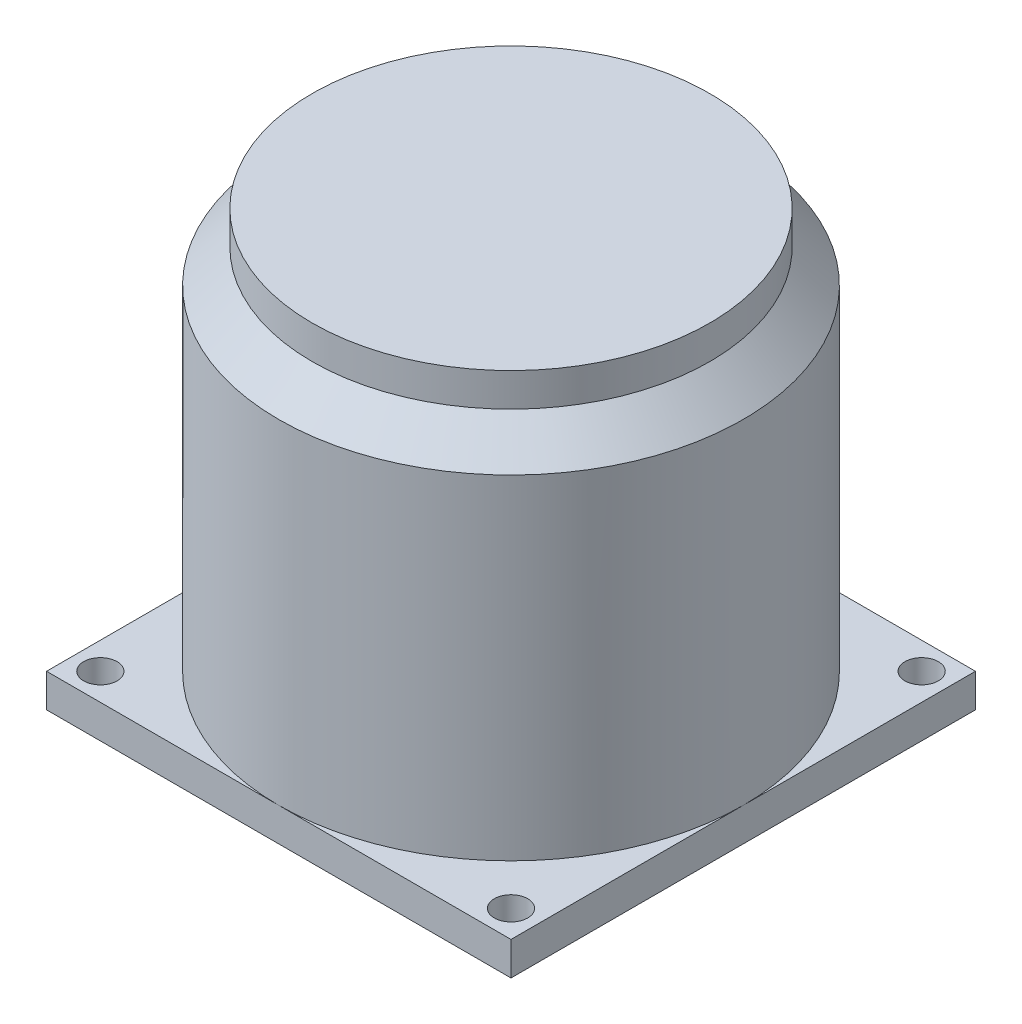
ISO-10303-21;
HEADER;
FILE_DESCRIPTION(('STEP AP214'),'2;1');
FILE_NAME('part.step','',(''),(''),'','','');
FILE_SCHEMA(('AUTOMOTIVE_DESIGN { 1 0 10303 214 1 1 1 1 }'));
ENDSEC;
DATA;
#1=APPLICATION_CONTEXT('core data for automotive mechanical design processes');
#2=APPLICATION_PROTOCOL_DEFINITION('international standard','automotive_design',2000,#1);
#3=PRODUCT_CONTEXT('',#1,'mechanical');
#4=PRODUCT('Part','Part','',(#3));
#5=PRODUCT_RELATED_PRODUCT_CATEGORY('part','',(#4));
#6=PRODUCT_DEFINITION_FORMATION('','',#4);
#7=PRODUCT_DEFINITION_CONTEXT('part definition',#1,'design');
#8=PRODUCT_DEFINITION('design','',#6,#7);
#9=PRODUCT_DEFINITION_SHAPE('','',#8);
#10=(LENGTH_UNIT() NAMED_UNIT(*) SI_UNIT(.MILLI.,.METRE.));
#11=(NAMED_UNIT(*) PLANE_ANGLE_UNIT() SI_UNIT($,.RADIAN.));
#12=(NAMED_UNIT(*) SI_UNIT($,.STERADIAN.) SOLID_ANGLE_UNIT());
#13=UNCERTAINTY_MEASURE_WITH_UNIT(LENGTH_MEASURE(1.E-05),#10,'distance_accuracy_value','');
#14=(GEOMETRIC_REPRESENTATION_CONTEXT(3) GLOBAL_UNCERTAINTY_ASSIGNED_CONTEXT((#13)) GLOBAL_UNIT_ASSIGNED_CONTEXT((#10,
#11,#12)) REPRESENTATION_CONTEXT('',''));
#15=CARTESIAN_POINT('',(0.,0.,0.));
#16=DIRECTION('',(0.,0.,1.));
#17=DIRECTION('',(1.,0.,0.));
#18=AXIS2_PLACEMENT_3D('',#15,#16,#17);
#19=CARTESIAN_POINT('',(0.,220.,0.));
#20=DIRECTION('',(0.,-1.,0.));
#21=DIRECTION('',(0.,0.,-1.));
#22=AXIS2_PLACEMENT_3D('',#19,#20,#21);
#23=CYLINDRICAL_SURFACE('',#22,139.);
#24=CARTESIAN_POINT('',(0.,200.,0.));
#25=DIRECTION('',(0.,1.,0.));
#26=DIRECTION('',(0.,0.,1.));
#27=AXIS2_PLACEMENT_3D('',#24,#25,#26);
#28=CIRCLE('',#27,139.);
#29=CARTESIAN_POINT('',(0.,200.,139.));
#30=VERTEX_POINT('',#29);
#31=EDGE_CURVE('E11',#30,#30,#28,.F.);
#32=ORIENTED_EDGE('',*,*,#31,.T.);
#33=EDGE_LOOP('',(#32));
#34=FACE_BOUND('',#33,.T.);
#35=CARTESIAN_POINT('',(0.,0.,0.));
#36=DIRECTION('',(0.,1.,0.));
#37=DIRECTION('',(0.,0.,1.));
#38=AXIS2_PLACEMENT_3D('',#35,#36,#37);
#39=CIRCLE('',#38,139.);
#40=CARTESIAN_POINT('',(0.,0.,139.));
#41=VERTEX_POINT('',#40);
#42=CARTESIAN_POINT('',(139.,0.,0.));
#43=VERTEX_POINT('',#42);
#44=EDGE_CURVE('E163',#41,#43,#39,.T.);
#45=ORIENTED_EDGE('',*,*,#44,.T.);
#46=CARTESIAN_POINT('',(0.,0.,-139.));
#47=VERTEX_POINT('',#46);
#48=EDGE_CURVE('E165',#43,#47,#39,.T.);
#49=ORIENTED_EDGE('',*,*,#48,.T.);
#50=CARTESIAN_POINT('',(-139.,0.,0.));
#51=VERTEX_POINT('',#50);
#52=EDGE_CURVE('E57',#47,#51,#39,.T.);
#53=ORIENTED_EDGE('',*,*,#52,.T.);
#54=EDGE_CURVE('E162',#51,#41,#39,.T.);
#55=ORIENTED_EDGE('',*,*,#54,.T.);
#56=EDGE_LOOP('',(#45,#49,#53,#55));
#57=FACE_BOUND('',#56,.T.);
#58=ADVANCED_FACE('F34',(#34,#57),#23,.T.);
#59=CARTESIAN_POINT('',(0.,220.,0.));
#60=DIRECTION('',(0.,-1.,0.));
#61=DIRECTION('',(0.,0.,-1.));
#62=AXIS2_PLACEMENT_3D('',#59,#60,#61);
#63=CONICAL_SURFACE('',#62,119.,0.785398163397449);
#64=ORIENTED_EDGE('',*,*,#31,.F.);
#65=EDGE_LOOP('',(#64));
#66=FACE_BOUND('',#65,.T.);
#67=CARTESIAN_POINT('',(0.,220.,0.));
#68=DIRECTION('',(0.,1.,0.));
#69=DIRECTION('',(0.,0.,1.));
#70=AXIS2_PLACEMENT_3D('',#67,#68,#69);
#71=CIRCLE('',#70,119.);
#72=CARTESIAN_POINT('',(0.,220.,119.));
#73=VERTEX_POINT('',#72);
#74=EDGE_CURVE('E42',#73,#73,#71,.T.);
#75=ORIENTED_EDGE('',*,*,#74,.F.);
#76=EDGE_LOOP('',(#75));
#77=FACE_BOUND('',#76,.T.);
#78=ADVANCED_FACE('F36',(#66,#77),#63,.T.);
#79=CARTESIAN_POINT('',(0.,240.,0.));
#80=DIRECTION('',(0.,-1.,0.));
#81=DIRECTION('',(0.,0.,-1.));
#82=AXIS2_PLACEMENT_3D('',#79,#80,#81);
#83=CYLINDRICAL_SURFACE('',#82,119.);
#84=CARTESIAN_POINT('',(0.,240.,0.));
#85=DIRECTION('',(0.,1.,0.));
#86=DIRECTION('',(0.,0.,1.));
#87=AXIS2_PLACEMENT_3D('',#84,#85,#86);
#88=CIRCLE('',#87,119.);
#89=CARTESIAN_POINT('',(0.,240.,119.));
#90=VERTEX_POINT('',#89);
#91=EDGE_CURVE('E100',#90,#90,#88,.T.);
#92=ORIENTED_EDGE('',*,*,#91,.F.);
#93=EDGE_LOOP('',(#92));
#94=FACE_BOUND('',#93,.T.);
#95=ORIENTED_EDGE('',*,*,#74,.T.);
#96=EDGE_LOOP('',(#95));
#97=FACE_BOUND('',#96,.T.);
#98=ADVANCED_FACE('F169',(#94,#97),#83,.T.);
#99=CARTESIAN_POINT('',(0.,240.,0.));
#100=DIRECTION('',(0.,1.,0.));
#101=DIRECTION('',(0.,0.,1.));
#102=AXIS2_PLACEMENT_3D('',#99,#100,#101);
#103=PLANE('',#102);
#104=ORIENTED_EDGE('',*,*,#91,.T.);
#105=EDGE_LOOP('',(#104));
#106=FACE_BOUND('',#105,.T.);
#107=ADVANCED_FACE('F177',(#106),#103,.T.);
#108=CARTESIAN_POINT('',(0.,0.,0.));
#109=DIRECTION('',(0.,-1.,0.));
#110=DIRECTION('',(0.,0.,-1.));
#111=AXIS2_PLACEMENT_3D('',#108,#109,#110);
#112=PLANE('',#111);
#113=ORIENTED_EDGE('',*,*,#44,.F.);
#114=DIRECTION('',(1.,0.,0.));
#115=VECTOR('',#114,1.);
#116=CARTESIAN_POINT('',(0.,0.,139.));
#117=LINE('',#116,#115);
#118=CARTESIAN_POINT('',(139.,0.,139.));
#119=VERTEX_POINT('',#118);
#120=EDGE_CURVE('E145',#41,#119,#117,.T.);
#121=ORIENTED_EDGE('',*,*,#120,.T.);
#122=DIRECTION('',(0.,0.,1.));
#123=VECTOR('',#122,1.);
#124=CARTESIAN_POINT('',(139.,0.,0.));
#125=LINE('',#124,#123);
#126=EDGE_CURVE('E141',#43,#119,#125,.T.);
#127=ORIENTED_EDGE('',*,*,#126,.F.);
#128=EDGE_LOOP('',(#113,#121,#127));
#129=FACE_BOUND('',#128,.T.);
#130=CARTESIAN_POINT('',(122.899316497498,0.,122.899316497498));
#131=DIRECTION('',(0.,-1.,0.));
#132=DIRECTION('',(0.,0.,-1.));
#133=AXIS2_PLACEMENT_3D('',#130,#131,#132);
#134=CIRCLE('',#133,10.);
#135=CARTESIAN_POINT('',(122.899316497498,0.,112.899316497498));
#136=VERTEX_POINT('',#135);
#137=EDGE_CURVE('E115',#136,#136,#134,.F.);
#138=ORIENTED_EDGE('',*,*,#137,.F.);
#139=EDGE_LOOP('',(#138));
#140=FACE_BOUND('',#139,.T.);
#141=ADVANCED_FACE('F189',(#129,#140),#112,.F.);
#142=ORIENTED_EDGE('',*,*,#48,.F.);
#143=CARTESIAN_POINT('',(139.,0.,-139.));
#144=VERTEX_POINT('',#143);
#145=EDGE_CURVE('E142',#144,#43,#125,.T.);
#146=ORIENTED_EDGE('',*,*,#145,.F.);
#147=DIRECTION('',(1.,0.,0.));
#148=VECTOR('',#147,1.);
#149=CARTESIAN_POINT('',(0.,0.,-139.));
#150=LINE('',#149,#148);
#151=EDGE_CURVE('E137',#47,#144,#150,.T.);
#152=ORIENTED_EDGE('',*,*,#151,.F.);
#153=EDGE_LOOP('',(#142,#146,#152));
#154=FACE_BOUND('',#153,.T.);
#155=CARTESIAN_POINT('',(122.899316497498,0.,-122.899316497498));
#156=DIRECTION('',(0.,-1.,0.));
#157=DIRECTION('',(0.,0.,-1.));
#158=AXIS2_PLACEMENT_3D('',#155,#156,#157);
#159=CIRCLE('',#158,10.);
#160=CARTESIAN_POINT('',(122.899316497498,0.,-132.899316497498));
#161=VERTEX_POINT('',#160);
#162=EDGE_CURVE('E150',#161,#161,#159,.T.);
#163=ORIENTED_EDGE('',*,*,#162,.T.);
#164=EDGE_LOOP('',(#163));
#165=FACE_BOUND('',#164,.T.);
#166=ADVANCED_FACE('F196',(#154,#165),#112,.F.);
#167=ORIENTED_EDGE('',*,*,#52,.F.);
#168=CARTESIAN_POINT('',(-139.,0.,-139.));
#169=VERTEX_POINT('',#168);
#170=EDGE_CURVE('E139',#169,#47,#150,.T.);
#171=ORIENTED_EDGE('',*,*,#170,.F.);
#172=DIRECTION('',(0.,0.,1.));
#173=VECTOR('',#172,1.);
#174=CARTESIAN_POINT('',(-139.,0.,0.));
#175=LINE('',#174,#173);
#176=EDGE_CURVE('E97',#169,#51,#175,.T.);
#177=ORIENTED_EDGE('',*,*,#176,.T.);
#178=EDGE_LOOP('',(#167,#171,#177));
#179=FACE_BOUND('',#178,.T.);
#180=CARTESIAN_POINT('',(-122.899316497498,0.,-122.899316497498));
#181=DIRECTION('',(0.,-1.,0.));
#182=DIRECTION('',(0.,0.,-1.));
#183=AXIS2_PLACEMENT_3D('',#180,#181,#182);
#184=CIRCLE('',#183,10.);
#185=CARTESIAN_POINT('',(-122.899316497498,0.,-132.899316497498));
#186=VERTEX_POINT('',#185);
#187=EDGE_CURVE('E147',#186,#186,#184,.F.);
#188=ORIENTED_EDGE('',*,*,#187,.F.);
#189=EDGE_LOOP('',(#188));
#190=FACE_BOUND('',#189,.T.);
#191=ADVANCED_FACE('F198',(#179,#190),#112,.F.);
#192=CARTESIAN_POINT('',(-139.,-20.,0.));
#193=DIRECTION('',(-1.,0.,0.));
#194=DIRECTION('',(0.,0.,1.));
#195=AXIS2_PLACEMENT_3D('',#192,#193,#194);
#196=PLANE('',#195);
#197=ORIENTED_EDGE('',*,*,#176,.F.);
#198=DIRECTION('',(0.,1.,0.));
#199=VECTOR('',#198,1.);
#200=CARTESIAN_POINT('',(-139.,-20.,-139.));
#201=LINE('',#200,#199);
#202=CARTESIAN_POINT('',(-139.,-20.,-139.));
#203=VERTEX_POINT('',#202);
#204=EDGE_CURVE('E89',#203,#169,#201,.T.);
#205=ORIENTED_EDGE('',*,*,#204,.F.);
#206=DIRECTION('',(0.,0.,1.));
#207=VECTOR('',#206,1.);
#208=CARTESIAN_POINT('',(-139.,-20.,0.));
#209=LINE('',#208,#207);
#210=CARTESIAN_POINT('',(-139.,-20.,139.));
#211=VERTEX_POINT('',#210);
#212=EDGE_CURVE('E94',#203,#211,#209,.T.);
#213=ORIENTED_EDGE('',*,*,#212,.T.);
#214=DIRECTION('',(0.,1.,0.));
#215=VECTOR('',#214,1.);
#216=CARTESIAN_POINT('',(-139.,-20.,139.));
#217=LINE('',#216,#215);
#218=CARTESIAN_POINT('',(-139.,0.,139.));
#219=VERTEX_POINT('',#218);
#220=EDGE_CURVE('E135',#211,#219,#217,.T.);
#221=ORIENTED_EDGE('',*,*,#220,.T.);
#222=EDGE_CURVE('E138',#51,#219,#175,.T.);
#223=ORIENTED_EDGE('',*,*,#222,.F.);
#224=EDGE_LOOP('',(#197,#205,#213,#221,#223));
#225=FACE_BOUND('',#224,.T.);
#226=ADVANCED_FACE('F91',(#225),#196,.T.);
#227=CARTESIAN_POINT('',(0.,-20.,-139.));
#228=DIRECTION('',(0.,0.,1.));
#229=DIRECTION('',(1.,0.,0.));
#230=AXIS2_PLACEMENT_3D('',#227,#228,#229);
#231=PLANE('',#230);
#232=ORIENTED_EDGE('',*,*,#170,.T.);
#233=ORIENTED_EDGE('',*,*,#151,.T.);
#234=DIRECTION('',(0.,1.,0.));
#235=VECTOR('',#234,1.);
#236=CARTESIAN_POINT('',(139.,-20.,-139.));
#237=LINE('',#236,#235);
#238=CARTESIAN_POINT('',(139.,-20.,-139.));
#239=VERTEX_POINT('',#238);
#240=EDGE_CURVE('E101',#239,#144,#237,.T.);
#241=ORIENTED_EDGE('',*,*,#240,.F.);
#242=DIRECTION('',(1.,0.,0.));
#243=VECTOR('',#242,1.);
#244=CARTESIAN_POINT('',(0.,-20.,-139.));
#245=LINE('',#244,#243);
#246=EDGE_CURVE('E104',#203,#239,#245,.T.);
#247=ORIENTED_EDGE('',*,*,#246,.F.);
#248=ORIENTED_EDGE('',*,*,#204,.T.);
#249=EDGE_LOOP('',(#232,#233,#241,#247,#248));
#250=FACE_BOUND('',#249,.T.);
#251=ADVANCED_FACE('F105',(#250),#231,.F.);
#252=CARTESIAN_POINT('',(139.,-20.,0.));
#253=DIRECTION('',(-1.,0.,0.));
#254=DIRECTION('',(0.,0.,1.));
#255=AXIS2_PLACEMENT_3D('',#252,#253,#254);
#256=PLANE('',#255);
#257=ORIENTED_EDGE('',*,*,#145,.T.);
#258=ORIENTED_EDGE('',*,*,#126,.T.);
#259=DIRECTION('',(0.,1.,0.));
#260=VECTOR('',#259,1.);
#261=CARTESIAN_POINT('',(139.,-20.,139.));
#262=LINE('',#261,#260);
#263=CARTESIAN_POINT('',(139.,-20.,139.));
#264=VERTEX_POINT('',#263);
#265=EDGE_CURVE('E156',#264,#119,#262,.T.);
#266=ORIENTED_EDGE('',*,*,#265,.F.);
#267=DIRECTION('',(0.,0.,1.));
#268=VECTOR('',#267,1.);
#269=CARTESIAN_POINT('',(139.,-20.,0.));
#270=LINE('',#269,#268);
#271=EDGE_CURVE('E109',#239,#264,#270,.T.);
#272=ORIENTED_EDGE('',*,*,#271,.F.);
#273=ORIENTED_EDGE('',*,*,#240,.T.);
#274=EDGE_LOOP('',(#257,#258,#266,#272,#273));
#275=FACE_BOUND('',#274,.T.);
#276=ADVANCED_FACE('F194',(#275),#256,.F.);
#277=CARTESIAN_POINT('',(-122.899316497498,-20.,122.899316497498));
#278=DIRECTION('',(0.,1.,0.));
#279=DIRECTION('',(0.,0.,1.));
#280=AXIS2_PLACEMENT_3D('',#277,#278,#279);
#281=CYLINDRICAL_SURFACE('',#280,10.);
#282=CARTESIAN_POINT('',(-122.899316497498,-20.,122.899316497498));
#283=DIRECTION('',(0.,-1.,0.));
#284=DIRECTION('',(0.,0.,-1.));
#285=AXIS2_PLACEMENT_3D('',#282,#283,#284);
#286=CIRCLE('',#285,10.);
#287=CARTESIAN_POINT('',(-122.899316497498,-20.,112.899316497498));
#288=VERTEX_POINT('',#287);
#289=EDGE_CURVE('E129',#288,#288,#286,.T.);
#290=ORIENTED_EDGE('',*,*,#289,.T.);
#291=EDGE_LOOP('',(#290));
#292=FACE_BOUND('',#291,.T.);
#293=CARTESIAN_POINT('',(-122.899316497498,0.,122.899316497498));
#294=DIRECTION('',(0.,-1.,0.));
#295=DIRECTION('',(0.,0.,-1.));
#296=AXIS2_PLACEMENT_3D('',#293,#294,#295);
#297=CIRCLE('',#296,10.);
#298=CARTESIAN_POINT('',(-122.899316497498,0.,112.899316497498));
#299=VERTEX_POINT('',#298);
#300=EDGE_CURVE('E118',#299,#299,#297,.T.);
#301=ORIENTED_EDGE('',*,*,#300,.F.);
#302=EDGE_LOOP('',(#301));
#303=FACE_BOUND('',#302,.T.);
#304=ADVANCED_FACE('F218',(#292,#303),#281,.F.);
#305=CARTESIAN_POINT('',(122.899316497498,-20.,-122.899316497498));
#306=DIRECTION('',(0.,1.,0.));
#307=DIRECTION('',(0.,0.,1.));
#308=AXIS2_PLACEMENT_3D('',#305,#306,#307);
#309=CYLINDRICAL_SURFACE('',#308,10.);
#310=CARTESIAN_POINT('',(122.899316497498,-20.,-122.899316497498));
#311=DIRECTION('',(0.,-1.,0.));
#312=DIRECTION('',(0.,0.,-1.));
#313=AXIS2_PLACEMENT_3D('',#310,#311,#312);
#314=CIRCLE('',#313,10.);
#315=CARTESIAN_POINT('',(122.899316497498,-20.,-132.899316497498));
#316=VERTEX_POINT('',#315);
#317=EDGE_CURVE('E126',#316,#316,#314,.T.);
#318=ORIENTED_EDGE('',*,*,#317,.T.);
#319=EDGE_LOOP('',(#318));
#320=FACE_BOUND('',#319,.T.);
#321=ORIENTED_EDGE('',*,*,#162,.F.);
#322=EDGE_LOOP('',(#321));
#323=FACE_BOUND('',#322,.T.);
#324=ADVANCED_FACE('F208',(#320,#323),#309,.F.);
#325=CARTESIAN_POINT('',(-122.899316497498,-20.,-122.899316497498));
#326=DIRECTION('',(0.,1.,0.));
#327=DIRECTION('',(0.,0.,1.));
#328=AXIS2_PLACEMENT_3D('',#325,#326,#327);
#329=CYLINDRICAL_SURFACE('',#328,10.);
#330=CARTESIAN_POINT('',(-122.899316497498,-20.,-122.899316497498));
#331=DIRECTION('',(0.,-1.,0.));
#332=DIRECTION('',(0.,0.,-1.));
#333=AXIS2_PLACEMENT_3D('',#330,#331,#332);
#334=CIRCLE('',#333,10.);
#335=CARTESIAN_POINT('',(-122.899316497498,-20.,-132.899316497498));
#336=VERTEX_POINT('',#335);
#337=EDGE_CURVE('E123',#336,#336,#334,.F.);
#338=ORIENTED_EDGE('',*,*,#337,.F.);
#339=EDGE_LOOP('',(#338));
#340=FACE_BOUND('',#339,.T.);
#341=ORIENTED_EDGE('',*,*,#187,.T.);
#342=EDGE_LOOP('',(#341));
#343=FACE_BOUND('',#342,.T.);
#344=ADVANCED_FACE('F205',(#340,#343),#329,.F.);
#345=CARTESIAN_POINT('',(0.,-20.,139.));
#346=DIRECTION('',(0.,0.,1.));
#347=DIRECTION('',(1.,0.,0.));
#348=AXIS2_PLACEMENT_3D('',#345,#346,#347);
#349=PLANE('',#348);
#350=EDGE_CURVE('E49',#219,#41,#117,.T.);
#351=ORIENTED_EDGE('',*,*,#350,.F.);
#352=ORIENTED_EDGE('',*,*,#220,.F.);
#353=DIRECTION('',(1.,0.,0.));
#354=VECTOR('',#353,1.);
#355=CARTESIAN_POINT('',(0.,-20.,139.));
#356=LINE('',#355,#354);
#357=EDGE_CURVE('E114',#211,#264,#356,.T.);
#358=ORIENTED_EDGE('',*,*,#357,.T.);
#359=ORIENTED_EDGE('',*,*,#265,.T.);
#360=ORIENTED_EDGE('',*,*,#120,.F.);
#361=EDGE_LOOP('',(#351,#352,#358,#359,#360));
#362=FACE_BOUND('',#361,.T.);
#363=ADVANCED_FACE('F207',(#362),#349,.T.);
#364=CARTESIAN_POINT('',(122.899316497498,-20.,122.899316497498));
#365=DIRECTION('',(0.,1.,0.));
#366=DIRECTION('',(0.,0.,1.));
#367=AXIS2_PLACEMENT_3D('',#364,#365,#366);
#368=CYLINDRICAL_SURFACE('',#367,10.);
#369=CARTESIAN_POINT('',(122.899316497498,-20.,122.899316497498));
#370=DIRECTION('',(0.,-1.,0.));
#371=DIRECTION('',(0.,0.,-1.));
#372=AXIS2_PLACEMENT_3D('',#369,#370,#371);
#373=CIRCLE('',#372,10.);
#374=CARTESIAN_POINT('',(122.899316497498,-20.,112.899316497498));
#375=VERTEX_POINT('',#374);
#376=EDGE_CURVE('E132',#375,#375,#373,.F.);
#377=ORIENTED_EDGE('',*,*,#376,.F.);
#378=EDGE_LOOP('',(#377));
#379=FACE_BOUND('',#378,.T.);
#380=ORIENTED_EDGE('',*,*,#137,.T.);
#381=EDGE_LOOP('',(#380));
#382=FACE_BOUND('',#381,.T.);
#383=ADVANCED_FACE('F215',(#379,#382),#368,.F.);
#384=CARTESIAN_POINT('',(0.,-20.,0.));
#385=DIRECTION('',(0.,-1.,0.));
#386=DIRECTION('',(0.,0.,-1.));
#387=AXIS2_PLACEMENT_3D('',#384,#385,#386);
#388=PLANE('',#387);
#389=ORIENTED_EDGE('',*,*,#212,.F.);
#390=ORIENTED_EDGE('',*,*,#246,.T.);
#391=ORIENTED_EDGE('',*,*,#271,.T.);
#392=ORIENTED_EDGE('',*,*,#357,.F.);
#393=EDGE_LOOP('',(#389,#390,#391,#392));
#394=FACE_BOUND('',#393,.T.);
#395=ORIENTED_EDGE('',*,*,#337,.T.);
#396=EDGE_LOOP('',(#395));
#397=FACE_BOUND('',#396,.T.);
#398=ORIENTED_EDGE('',*,*,#317,.F.);
#399=EDGE_LOOP('',(#398));
#400=FACE_BOUND('',#399,.T.);
#401=ORIENTED_EDGE('',*,*,#289,.F.);
#402=EDGE_LOOP('',(#401));
#403=FACE_BOUND('',#402,.T.);
#404=ORIENTED_EDGE('',*,*,#376,.T.);
#405=EDGE_LOOP('',(#404));
#406=FACE_BOUND('',#405,.T.);
#407=ADVANCED_FACE('F111',(#394,#397,#400,#403,#406),#388,.T.);
#408=ORIENTED_EDGE('',*,*,#54,.F.);
#409=ORIENTED_EDGE('',*,*,#222,.T.);
#410=ORIENTED_EDGE('',*,*,#350,.T.);
#411=EDGE_LOOP('',(#408,#409,#410));
#412=FACE_BOUND('',#411,.T.);
#413=ORIENTED_EDGE('',*,*,#300,.T.);
#414=EDGE_LOOP('',(#413));
#415=FACE_BOUND('',#414,.T.);
#416=ADVANCED_FACE('F202',(#412,#415),#112,.F.);
#417=CLOSED_SHELL('',(#58,#78,#98,#107,#141,#166,#191,#226,#251,#276,#304,#324,#344,#363,#383,
#407,#416));
#418=MANIFOLD_SOLID_BREP('B2',#417);
#419=ADVANCED_BREP_SHAPE_REPRESENTATION('',(#18,#418),#14);
#420=SHAPE_DEFINITION_REPRESENTATION(#9,#419);
ENDSEC;
END-ISO-10303-21;
